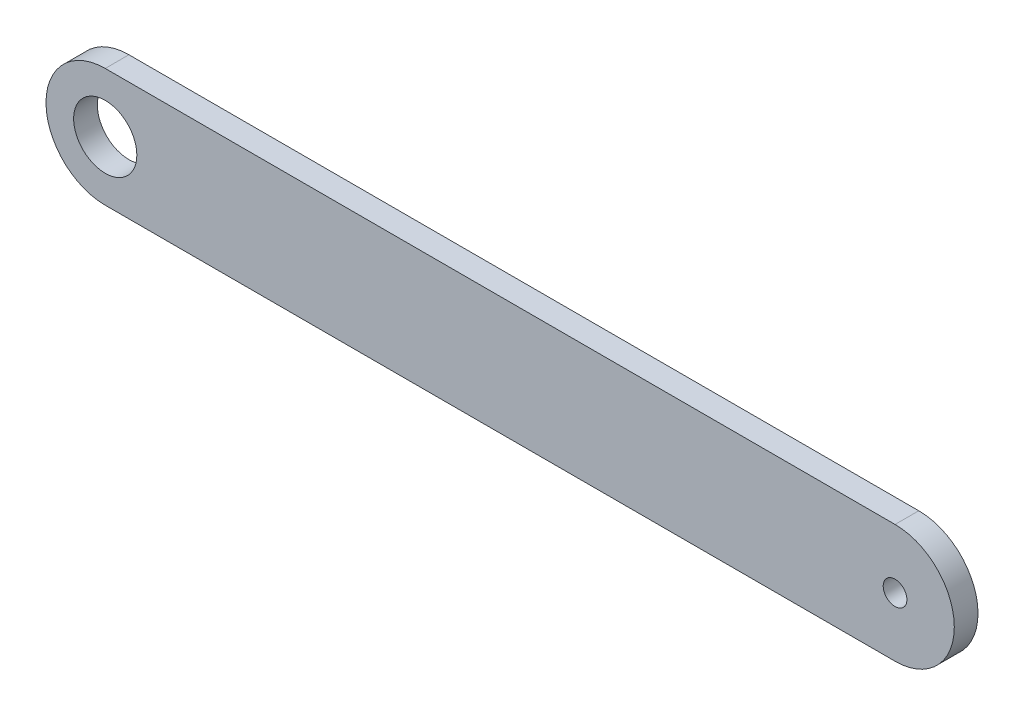
ISO-10303-21;
HEADER;
FILE_DESCRIPTION(('STEP AP214'),'2;1');
FILE_NAME('part.step','',(''),(''),'','','');
FILE_SCHEMA(('AUTOMOTIVE_DESIGN { 1 0 10303 214 1 1 1 1 }'));
ENDSEC;
DATA;
#1=APPLICATION_CONTEXT('core data for automotive mechanical design processes');
#2=APPLICATION_PROTOCOL_DEFINITION('international standard','automotive_design',2000,#1);
#3=PRODUCT_CONTEXT('',#1,'mechanical');
#4=PRODUCT('Part','Part','',(#3));
#5=PRODUCT_RELATED_PRODUCT_CATEGORY('part','',(#4));
#6=PRODUCT_DEFINITION_FORMATION('','',#4);
#7=PRODUCT_DEFINITION_CONTEXT('part definition',#1,'design');
#8=PRODUCT_DEFINITION('design','',#6,#7);
#9=PRODUCT_DEFINITION_SHAPE('','',#8);
#10=(LENGTH_UNIT() NAMED_UNIT(*) SI_UNIT(.MILLI.,.METRE.));
#11=(NAMED_UNIT(*) PLANE_ANGLE_UNIT() SI_UNIT($,.RADIAN.));
#12=(NAMED_UNIT(*) SI_UNIT($,.STERADIAN.) SOLID_ANGLE_UNIT());
#13=UNCERTAINTY_MEASURE_WITH_UNIT(LENGTH_MEASURE(1.E-05),#10,'distance_accuracy_value','');
#14=(GEOMETRIC_REPRESENTATION_CONTEXT(3) GLOBAL_UNCERTAINTY_ASSIGNED_CONTEXT((#13)) GLOBAL_UNIT_ASSIGNED_CONTEXT((#10,
#11,#12)) REPRESENTATION_CONTEXT('',''));
#15=CARTESIAN_POINT('',(0.,0.,0.));
#16=DIRECTION('',(0.,0.,1.));
#17=DIRECTION('',(1.,0.,0.));
#18=AXIS2_PLACEMENT_3D('',#15,#16,#17);
#19=CARTESIAN_POINT('',(0.,0.,3.));
#20=DIRECTION('',(0.,0.,-1.));
#21=DIRECTION('',(-1.,0.,0.));
#22=AXIS2_PLACEMENT_3D('',#19,#20,#21);
#23=CYLINDRICAL_SURFACE('',#22,7.5);
#24=CARTESIAN_POINT('',(0.,0.,0.));
#25=DIRECTION('',(0.,0.,1.));
#26=DIRECTION('',(1.,0.,0.));
#27=AXIS2_PLACEMENT_3D('',#24,#25,#26);
#28=CIRCLE('',#27,7.5);
#29=CARTESIAN_POINT('',(0.,7.5,0.));
#30=VERTEX_POINT('',#29);
#31=CARTESIAN_POINT('',(0.,-7.5,0.));
#32=VERTEX_POINT('',#31);
#33=EDGE_CURVE('E103',#30,#32,#28,.T.);
#34=ORIENTED_EDGE('',*,*,#33,.T.);
#35=DIRECTION('',(0.,0.,-1.));
#36=VECTOR('',#35,1.);
#37=CARTESIAN_POINT('',(0.,-7.5,3.));
#38=LINE('',#37,#36);
#39=CARTESIAN_POINT('',(0.,-7.5,3.));
#40=VERTEX_POINT('',#39);
#41=EDGE_CURVE('E11',#40,#32,#38,.T.);
#42=ORIENTED_EDGE('',*,*,#41,.F.);
#43=CARTESIAN_POINT('',(0.,0.,3.));
#44=DIRECTION('',(0.,0.,1.));
#45=DIRECTION('',(1.,0.,0.));
#46=AXIS2_PLACEMENT_3D('',#43,#44,#45);
#47=CIRCLE('',#46,7.5);
#48=CARTESIAN_POINT('',(0.,7.5,3.));
#49=VERTEX_POINT('',#48);
#50=EDGE_CURVE('E88',#49,#40,#47,.T.);
#51=ORIENTED_EDGE('',*,*,#50,.F.);
#52=DIRECTION('',(0.,0.,-1.));
#53=VECTOR('',#52,1.);
#54=CARTESIAN_POINT('',(0.,7.5,3.));
#55=LINE('',#54,#53);
#56=EDGE_CURVE('E55',#49,#30,#55,.T.);
#57=ORIENTED_EDGE('',*,*,#56,.T.);
#58=EDGE_LOOP('',(#34,#42,#51,#57));
#59=FACE_BOUND('',#58,.T.);
#60=ADVANCED_FACE('F37',(#59),#23,.T.);
#61=CARTESIAN_POINT('',(0.,-7.5,3.));
#62=DIRECTION('',(0.,1.,0.));
#63=DIRECTION('',(-1.,0.,0.));
#64=AXIS2_PLACEMENT_3D('',#61,#62,#63);
#65=PLANE('',#64);
#66=DIRECTION('',(1.,0.,0.));
#67=VECTOR('',#66,1.);
#68=CARTESIAN_POINT('',(0.,-7.5,0.));
#69=LINE('',#68,#67);
#70=CARTESIAN_POINT('',(100.,-7.50000000000001,0.));
#71=VERTEX_POINT('',#70);
#72=EDGE_CURVE('E93',#32,#71,#69,.T.);
#73=ORIENTED_EDGE('',*,*,#72,.T.);
#74=DIRECTION('',(0.,0.,-1.));
#75=VECTOR('',#74,1.);
#76=CARTESIAN_POINT('',(100.,-7.50000000000001,3.));
#77=LINE('',#76,#75);
#78=CARTESIAN_POINT('',(100.,-7.50000000000001,3.));
#79=VERTEX_POINT('',#78);
#80=EDGE_CURVE('E46',#79,#71,#77,.T.);
#81=ORIENTED_EDGE('',*,*,#80,.F.);
#82=DIRECTION('',(1.,0.,0.));
#83=VECTOR('',#82,1.);
#84=CARTESIAN_POINT('',(0.,-7.5,3.));
#85=LINE('',#84,#83);
#86=EDGE_CURVE('E81',#40,#79,#85,.T.);
#87=ORIENTED_EDGE('',*,*,#86,.F.);
#88=ORIENTED_EDGE('',*,*,#41,.T.);
#89=EDGE_LOOP('',(#73,#81,#87,#88));
#90=FACE_BOUND('',#89,.T.);
#91=ADVANCED_FACE('F92',(#90),#65,.F.);
#92=CARTESIAN_POINT('',(100.,0.,3.));
#93=DIRECTION('',(0.,0.,-1.));
#94=DIRECTION('',(-1.,0.,0.));
#95=AXIS2_PLACEMENT_3D('',#92,#93,#94);
#96=CYLINDRICAL_SURFACE('',#95,7.50000000000001);
#97=CARTESIAN_POINT('',(100.,0.,0.));
#98=DIRECTION('',(0.,0.,1.));
#99=DIRECTION('',(1.,0.,0.));
#100=AXIS2_PLACEMENT_3D('',#97,#98,#99);
#101=CIRCLE('',#100,7.50000000000001);
#102=CARTESIAN_POINT('',(100.,7.50000000000001,0.));
#103=VERTEX_POINT('',#102);
#104=EDGE_CURVE('E106',#71,#103,#101,.T.);
#105=ORIENTED_EDGE('',*,*,#104,.T.);
#106=DIRECTION('',(0.,0.,-1.));
#107=VECTOR('',#106,1.);
#108=CARTESIAN_POINT('',(100.,7.50000000000001,3.));
#109=LINE('',#108,#107);
#110=CARTESIAN_POINT('',(100.,7.50000000000001,3.));
#111=VERTEX_POINT('',#110);
#112=EDGE_CURVE('E70',#111,#103,#109,.T.);
#113=ORIENTED_EDGE('',*,*,#112,.F.);
#114=CARTESIAN_POINT('',(100.,0.,3.));
#115=DIRECTION('',(0.,0.,1.));
#116=DIRECTION('',(1.,0.,0.));
#117=AXIS2_PLACEMENT_3D('',#114,#115,#116);
#118=CIRCLE('',#117,7.50000000000001);
#119=EDGE_CURVE('E87',#79,#111,#118,.T.);
#120=ORIENTED_EDGE('',*,*,#119,.F.);
#121=ORIENTED_EDGE('',*,*,#80,.T.);
#122=EDGE_LOOP('',(#105,#113,#120,#121));
#123=FACE_BOUND('',#122,.T.);
#124=ADVANCED_FACE('F97',(#123),#96,.T.);
#125=CARTESIAN_POINT('',(0.,7.5,3.));
#126=DIRECTION('',(0.,1.,0.));
#127=DIRECTION('',(-1.,0.,0.));
#128=AXIS2_PLACEMENT_3D('',#125,#126,#127);
#129=PLANE('',#128);
#130=DIRECTION('',(1.,0.,0.));
#131=VECTOR('',#130,1.);
#132=CARTESIAN_POINT('',(0.,7.5,0.));
#133=LINE('',#132,#131);
#134=EDGE_CURVE('E108',#30,#103,#133,.T.);
#135=ORIENTED_EDGE('',*,*,#134,.F.);
#136=ORIENTED_EDGE('',*,*,#56,.F.);
#137=DIRECTION('',(1.,0.,0.));
#138=VECTOR('',#137,1.);
#139=CARTESIAN_POINT('',(0.,7.5,3.));
#140=LINE('',#139,#138);
#141=EDGE_CURVE('E98',#49,#111,#140,.T.);
#142=ORIENTED_EDGE('',*,*,#141,.T.);
#143=ORIENTED_EDGE('',*,*,#112,.T.);
#144=EDGE_LOOP('',(#135,#136,#142,#143));
#145=FACE_BOUND('',#144,.T.);
#146=ADVANCED_FACE('F132',(#145),#129,.T.);
#147=CARTESIAN_POINT('',(0.,0.,3.));
#148=DIRECTION('',(0.,0.,1.));
#149=DIRECTION('',(1.,0.,0.));
#150=AXIS2_PLACEMENT_3D('',#147,#148,#149);
#151=PLANE('',#150);
#152=CARTESIAN_POINT('',(0.,0.,3.));
#153=DIRECTION('',(0.,0.,1.));
#154=DIRECTION('',(1.,0.,0.));
#155=AXIS2_PLACEMENT_3D('',#152,#153,#154);
#156=CIRCLE('',#155,4.);
#157=CARTESIAN_POINT('',(4.,0.,3.));
#158=VERTEX_POINT('',#157);
#159=EDGE_CURVE('E114',#158,#158,#156,.T.);
#160=ORIENTED_EDGE('',*,*,#159,.F.);
#161=EDGE_LOOP('',(#160));
#162=FACE_BOUND('',#161,.T.);
#163=CARTESIAN_POINT('',(100.,0.,3.));
#164=DIRECTION('',(0.,0.,1.));
#165=DIRECTION('',(1.,0.,0.));
#166=AXIS2_PLACEMENT_3D('',#163,#164,#165);
#167=CIRCLE('',#166,1.5);
#168=CARTESIAN_POINT('',(101.5,0.,3.));
#169=VERTEX_POINT('',#168);
#170=EDGE_CURVE('E119',#169,#169,#167,.T.);
#171=ORIENTED_EDGE('',*,*,#170,.F.);
#172=EDGE_LOOP('',(#171));
#173=FACE_BOUND('',#172,.T.);
#174=ORIENTED_EDGE('',*,*,#50,.T.);
#175=ORIENTED_EDGE('',*,*,#86,.T.);
#176=ORIENTED_EDGE('',*,*,#119,.T.);
#177=ORIENTED_EDGE('',*,*,#141,.F.);
#178=EDGE_LOOP('',(#174,#175,#176,#177));
#179=FACE_BOUND('',#178,.T.);
#180=ADVANCED_FACE('F84',(#162,#173,#179),#151,.T.);
#181=CARTESIAN_POINT('',(0.,0.,0.));
#182=DIRECTION('',(0.,0.,1.));
#183=DIRECTION('',(1.,0.,0.));
#184=AXIS2_PLACEMENT_3D('',#181,#182,#183);
#185=PLANE('',#184);
#186=CARTESIAN_POINT('',(0.,0.,0.));
#187=DIRECTION('',(0.,0.,1.));
#188=DIRECTION('',(1.,0.,0.));
#189=AXIS2_PLACEMENT_3D('',#186,#187,#188);
#190=CIRCLE('',#189,4.);
#191=CARTESIAN_POINT('',(4.,0.,0.));
#192=VERTEX_POINT('',#191);
#193=EDGE_CURVE('E40',#192,#192,#190,.T.);
#194=ORIENTED_EDGE('',*,*,#193,.T.);
#195=EDGE_LOOP('',(#194));
#196=FACE_BOUND('',#195,.T.);
#197=CARTESIAN_POINT('',(100.,0.,0.));
#198=DIRECTION('',(0.,0.,1.));
#199=DIRECTION('',(1.,0.,0.));
#200=AXIS2_PLACEMENT_3D('',#197,#198,#199);
#201=CIRCLE('',#200,1.5);
#202=CARTESIAN_POINT('',(101.5,0.,0.));
#203=VERTEX_POINT('',#202);
#204=EDGE_CURVE('E112',#203,#203,#201,.T.);
#205=ORIENTED_EDGE('',*,*,#204,.T.);
#206=EDGE_LOOP('',(#205));
#207=FACE_BOUND('',#206,.T.);
#208=ORIENTED_EDGE('',*,*,#33,.F.);
#209=ORIENTED_EDGE('',*,*,#134,.T.);
#210=ORIENTED_EDGE('',*,*,#104,.F.);
#211=ORIENTED_EDGE('',*,*,#72,.F.);
#212=EDGE_LOOP('',(#208,#209,#210,#211));
#213=FACE_BOUND('',#212,.T.);
#214=ADVANCED_FACE('F131',(#196,#207,#213),#185,.F.);
#215=CARTESIAN_POINT('',(100.,0.,-7.));
#216=DIRECTION('',(0.,0.,1.));
#217=DIRECTION('',(1.,0.,0.));
#218=AXIS2_PLACEMENT_3D('',#215,#216,#217);
#219=CYLINDRICAL_SURFACE('',#218,1.5);
#220=ORIENTED_EDGE('',*,*,#170,.T.);
#221=EDGE_LOOP('',(#220));
#222=FACE_BOUND('',#221,.T.);
#223=ORIENTED_EDGE('',*,*,#204,.F.);
#224=EDGE_LOOP('',(#223));
#225=FACE_BOUND('',#224,.T.);
#226=ADVANCED_FACE('F127',(#222,#225),#219,.F.);
#227=CARTESIAN_POINT('',(0.,0.,-7.));
#228=DIRECTION('',(0.,0.,1.));
#229=DIRECTION('',(1.,0.,0.));
#230=AXIS2_PLACEMENT_3D('',#227,#228,#229);
#231=CYLINDRICAL_SURFACE('',#230,4.);
#232=ORIENTED_EDGE('',*,*,#159,.T.);
#233=EDGE_LOOP('',(#232));
#234=FACE_BOUND('',#233,.T.);
#235=ORIENTED_EDGE('',*,*,#193,.F.);
#236=EDGE_LOOP('',(#235));
#237=FACE_BOUND('',#236,.T.);
#238=ADVANCED_FACE('F181',(#234,#237),#231,.F.);
#239=CLOSED_SHELL('',(#60,#91,#124,#146,#180,#214,#226,#238));
#240=MANIFOLD_SOLID_BREP('B2',#239);
#241=ADVANCED_BREP_SHAPE_REPRESENTATION('',(#18,#240),#14);
#242=SHAPE_DEFINITION_REPRESENTATION(#9,#241);
ENDSEC;
END-ISO-10303-21;
